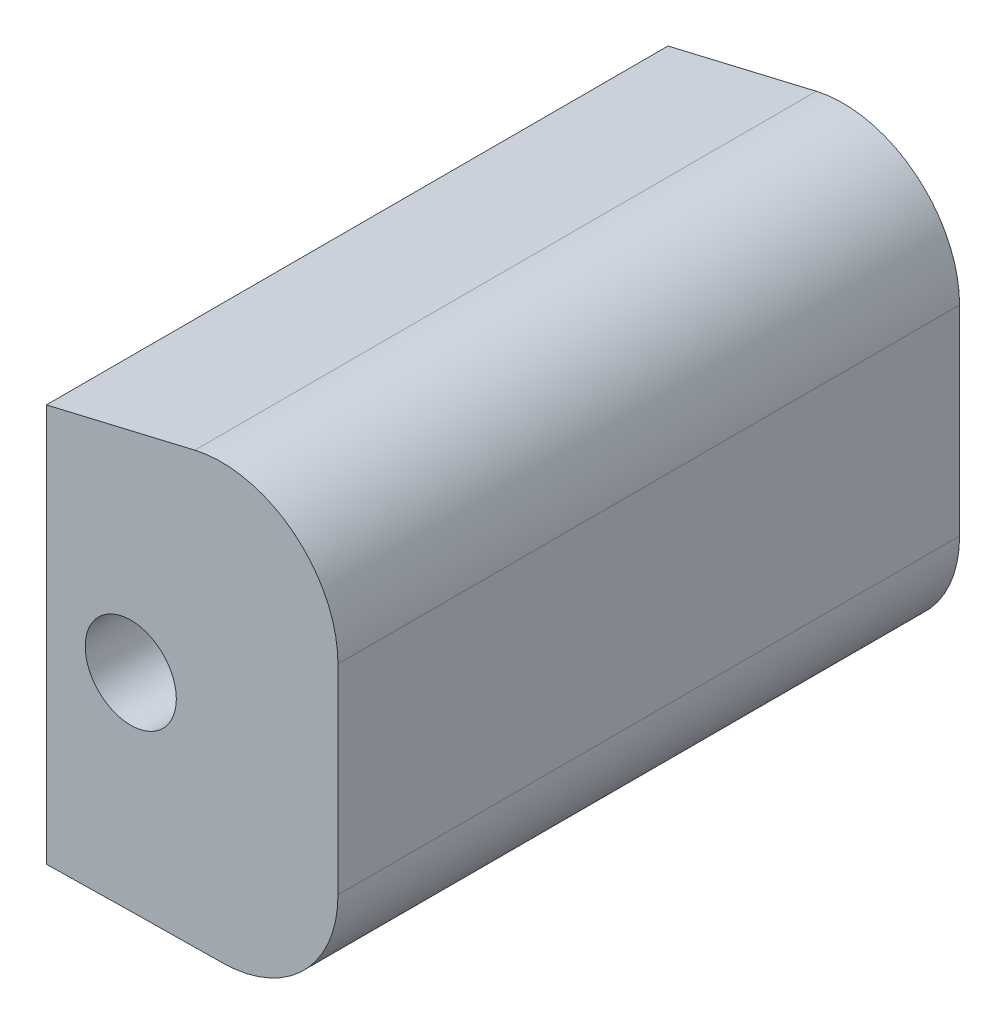
ISO-10303-21;
HEADER;
FILE_DESCRIPTION(('STEP AP214'),'2;1');
FILE_NAME('part.step','',(''),(''),'','','');
FILE_SCHEMA(('AUTOMOTIVE_DESIGN { 1 0 10303 214 1 1 1 1 }'));
ENDSEC;
DATA;
#1=APPLICATION_CONTEXT('core data for automotive mechanical design processes');
#2=APPLICATION_PROTOCOL_DEFINITION('international standard','automotive_design',2000,#1);
#3=PRODUCT_CONTEXT('',#1,'mechanical');
#4=PRODUCT('Part','Part','',(#3));
#5=PRODUCT_RELATED_PRODUCT_CATEGORY('part','',(#4));
#6=PRODUCT_DEFINITION_FORMATION('','',#4);
#7=PRODUCT_DEFINITION_CONTEXT('part definition',#1,'design');
#8=PRODUCT_DEFINITION('design','',#6,#7);
#9=PRODUCT_DEFINITION_SHAPE('','',#8);
#10=(LENGTH_UNIT() NAMED_UNIT(*) SI_UNIT(.MILLI.,.METRE.));
#11=(NAMED_UNIT(*) PLANE_ANGLE_UNIT() SI_UNIT($,.RADIAN.));
#12=(NAMED_UNIT(*) SI_UNIT($,.STERADIAN.) SOLID_ANGLE_UNIT());
#13=UNCERTAINTY_MEASURE_WITH_UNIT(LENGTH_MEASURE(1.E-05),#10,'distance_accuracy_value','');
#14=(GEOMETRIC_REPRESENTATION_CONTEXT(3) GLOBAL_UNCERTAINTY_ASSIGNED_CONTEXT((#13)) GLOBAL_UNIT_ASSIGNED_CONTEXT((#10,
#11,#12)) REPRESENTATION_CONTEXT('',''));
#15=CARTESIAN_POINT('',(0.,0.,0.));
#16=DIRECTION('',(0.,0.,1.));
#17=DIRECTION('',(1.,0.,0.));
#18=AXIS2_PLACEMENT_3D('',#15,#16,#17);
#19=CARTESIAN_POINT('',(-6.3156767121804,2.1580285927083,27.0764));
#20=DIRECTION('',(0.,0.,-1.));
#21=DIRECTION('',(-1.,0.,0.));
#22=AXIS2_PLACEMENT_3D('',#19,#20,#21);
#23=PLANE('',#22);
#24=CARTESIAN_POINT('',(36.6810985985652,13.2095369144677,27.0764));
#25=CARTESIAN_POINT('',(19.8297656446093,9.26724001295322,27.0764));
#26=CARTESIAN_POINT('',(-2.07358994292178,3.84406830419772,27.0764));
#27=CARTESIAN_POINT('',(-31.0964662188296,-5.54591449337639,27.0764));
#28=CARTESIAN_POINT('',(-39.3167651645247,-8.80663166059082,27.0764));
#29=CARTESIAN_POINT('',(-49.5155563234086,-12.4956604853466,27.0764));
#30=CARTESIAN_POINT('',(-45.7724895500792,-12.1068503903365,27.0764));
#31=B_SPLINE_CURVE_WITH_KNOTS('',3,(#24,#25,#26,#27,#28,#29,#30),.UNSPECIFIED.,.F.,.F.,(4,1,1,1,
4),(0.118068853294986,0.630725310694853,0.824213609270468,0.940085476785923,1.),.UNSPECIFIED.);
#32=CARTESIAN_POINT('',(36.6810985985652,13.2095369144677,27.0764));
#33=VERTEX_POINT('',#32);
#34=CARTESIAN_POINT('',(30.218297493358,11.6851028498249,27.0764));
#35=VERTEX_POINT('',#34);
#36=EDGE_CURVE('E107',#33,#35,#31,.T.);
#37=ORIENTED_EDGE('',*,*,#36,.T.);
#38=DIRECTION('',(0.,1.,0.));
#39=VECTOR('',#38,1.);
#40=CARTESIAN_POINT('',(30.218297493358,14.1187599185988,27.0764));
#41=LINE('',#40,#39);
#42=CARTESIAN_POINT('',(30.218297493358,-5.64214160240989,27.0764));
#43=VERTEX_POINT('',#42);
#44=EDGE_CURVE('E101',#43,#35,#41,.T.);
#45=ORIENTED_EDGE('',*,*,#44,.F.);
#46=CARTESIAN_POINT('',(-45.7724895500792,-12.1068503903365,27.0764));
#47=CARTESIAN_POINT('',(-41.3374436992652,-10.9992654887815,27.0764));
#48=CARTESIAN_POINT('',(-33.8316096279073,-10.5300430967119,27.0764));
#49=CARTESIAN_POINT('',(-20.4834982570784,-8.70754719775505,27.0764));
#50=CARTESIAN_POINT('',(-8.87343365419412,-8.01917435004237,27.0764));
#51=CARTESIAN_POINT('',(11.5245885947209,-6.02817132263064,27.0764));
#52=CARTESIAN_POINT('',(26.0673219730606,-5.65978493925108,27.0764));
#53=CARTESIAN_POINT('',(37.8951419594641,-5.52742505549688,27.0764));
#54=B_SPLINE_CURVE_WITH_KNOTS('',3,(#46,#47,#48,#49,#50,#51,#52,#53),.UNSPECIFIED.,.F.,.F.,(4,1,
1,1,1,4),(0.,0.144322392153104,0.23794765175378,0.427122749709389,0.512831912207282,
0.887817721212676),.UNSPECIFIED.);
#55=CARTESIAN_POINT('',(37.8951419594641,-5.52742505549687,27.0764));
#56=VERTEX_POINT('',#55);
#57=EDGE_CURVE('E92',#43,#56,#54,.T.);
#58=ORIENTED_EDGE('',*,*,#57,.T.);
#59=CARTESIAN_POINT('',(37.838297493358,-0.44774310613498,27.0764));
#60=DIRECTION('',(0.,0.,1.));
#61=DIRECTION('',(1.,0.,0.));
#62=AXIS2_PLACEMENT_3D('',#59,#60,#61);
#63=CIRCLE('',#62,5.07999999999999);
#64=CARTESIAN_POINT('',(42.918297493358,-0.44774310613498,27.0764));
#65=VERTEX_POINT('',#64);
#66=EDGE_CURVE('E114',#56,#65,#63,.T.);
#67=ORIENTED_EDGE('',*,*,#66,.T.);
#68=DIRECTION('',(0.,1.,0.));
#69=VECTOR('',#68,1.);
#70=CARTESIAN_POINT('',(42.918297493358,-0.44774310613498,27.0764));
#71=LINE('',#70,#69);
#72=CARTESIAN_POINT('',(42.918297493358,8.26309468616961,27.0764));
#73=VERTEX_POINT('',#72);
#74=EDGE_CURVE('E118',#65,#73,#71,.T.);
#75=ORIENTED_EDGE('',*,*,#74,.T.);
#76=CARTESIAN_POINT('',(37.838297493358,8.26309468616961,27.0764));
#77=DIRECTION('',(0.,0.,1.));
#78=DIRECTION('',(1.,0.,0.));
#79=AXIS2_PLACEMENT_3D('',#76,#77,#78);
#80=CIRCLE('',#79,5.08000000000001);
#81=EDGE_CURVE('E64',#73,#33,#80,.T.);
#82=ORIENTED_EDGE('',*,*,#81,.T.);
#83=EDGE_LOOP('',(#37,#45,#58,#67,#75,#82));
#84=FACE_BOUND('',#83,.T.);
#85=CARTESIAN_POINT('',(33.8934696801539,3.42171785114349,27.0764));
#86=DIRECTION('',(0.,0.,1.));
#87=DIRECTION('',(1.,0.,0.));
#88=AXIS2_PLACEMENT_3D('',#85,#86,#87);
#89=CIRCLE('',#88,1.984375);
#90=CARTESIAN_POINT('',(35.877844680154,3.42171785114349,27.0764));
#91=VERTEX_POINT('',#90);
#92=EDGE_CURVE('E218',#91,#91,#89,.T.);
#93=ORIENTED_EDGE('',*,*,#92,.F.);
#94=EDGE_LOOP('',(#93));
#95=FACE_BOUND('',#94,.T.);
#96=ADVANCED_FACE('F39',(#84,#95),#23,.F.);
#97=CARTESIAN_POINT('',(-6.3156767121804,2.1580285927083,0.));
#98=DIRECTION('',(0.,0.,-1.));
#99=DIRECTION('',(-1.,0.,0.));
#100=AXIS2_PLACEMENT_3D('',#97,#98,#99);
#101=PLANE('',#100);
#102=DIRECTION('',(0.,1.,0.));
#103=VECTOR('',#102,1.);
#104=CARTESIAN_POINT('',(30.218297493358,14.1187599185988,0.));
#105=LINE('',#104,#103);
#106=CARTESIAN_POINT('',(30.2182974931756,-5.64214160240989,0.));
#107=VERTEX_POINT('',#106);
#108=CARTESIAN_POINT('',(30.218297493358,11.6851028498249,0.));
#109=VERTEX_POINT('',#108);
#110=EDGE_CURVE('E56',#107,#109,#105,.T.);
#111=ORIENTED_EDGE('',*,*,#110,.T.);
#112=CARTESIAN_POINT('',(36.6810985985652,13.2095369144677,0.));
#113=CARTESIAN_POINT('',(19.8297656446093,9.26724001295322,0.));
#114=CARTESIAN_POINT('',(-2.07358994292178,3.84406830419772,0.));
#115=CARTESIAN_POINT('',(-31.0964662188296,-5.54591449337639,0.));
#116=CARTESIAN_POINT('',(-39.3167651645247,-8.80663166059082,0.));
#117=CARTESIAN_POINT('',(-49.5155563234086,-12.4956604853466,0.));
#118=CARTESIAN_POINT('',(-45.7724895500792,-12.1068503903365,0.));
#119=B_SPLINE_CURVE_WITH_KNOTS('',3,(#112,#113,#114,#115,#116,#117,#118),.UNSPECIFIED.,.F.,.F.,
(4,1,1,1,4),(0.118068853294986,0.630725310694853,0.824213609270468,0.940085476785923,1.),.UNSPECIFIED.);
#120=CARTESIAN_POINT('',(36.6810985985652,13.2095369144677,0.));
#121=VERTEX_POINT('',#120);
#122=EDGE_CURVE('E213',#121,#109,#119,.T.);
#123=ORIENTED_EDGE('',*,*,#122,.F.);
#124=CARTESIAN_POINT('',(37.838297493358,8.26309468616961,0.));
#125=DIRECTION('',(0.,0.,1.));
#126=DIRECTION('',(1.,0.,0.));
#127=AXIS2_PLACEMENT_3D('',#124,#125,#126);
#128=CIRCLE('',#127,5.08000000000001);
#129=CARTESIAN_POINT('',(42.918297493358,8.26309468616961,0.));
#130=VERTEX_POINT('',#129);
#131=EDGE_CURVE('E85',#130,#121,#128,.T.);
#132=ORIENTED_EDGE('',*,*,#131,.F.);
#133=DIRECTION('',(0.,1.,0.));
#134=VECTOR('',#133,1.);
#135=CARTESIAN_POINT('',(42.918297493358,-0.44774310613498,0.));
#136=LINE('',#135,#134);
#137=CARTESIAN_POINT('',(42.918297493358,-0.44774310613498,0.));
#138=VERTEX_POINT('',#137);
#139=EDGE_CURVE('E241',#138,#130,#136,.T.);
#140=ORIENTED_EDGE('',*,*,#139,.F.);
#141=CARTESIAN_POINT('',(37.838297493358,-0.44774310613498,0.));
#142=DIRECTION('',(0.,0.,1.));
#143=DIRECTION('',(1.,0.,0.));
#144=AXIS2_PLACEMENT_3D('',#141,#142,#143);
#145=CIRCLE('',#144,5.07999999999999);
#146=CARTESIAN_POINT('',(37.8951419594641,-5.52742505549687,0.));
#147=VERTEX_POINT('',#146);
#148=EDGE_CURVE('E222',#147,#138,#145,.T.);
#149=ORIENTED_EDGE('',*,*,#148,.F.);
#150=CARTESIAN_POINT('',(-45.7724895500792,-12.1068503903365,0.));
#151=CARTESIAN_POINT('',(-41.3374436992652,-10.9992654887815,0.));
#152=CARTESIAN_POINT('',(-33.8316096279073,-10.5300430967119,0.));
#153=CARTESIAN_POINT('',(-20.4834982570784,-8.70754719775505,0.));
#154=CARTESIAN_POINT('',(-8.87343365419412,-8.01917435004237,0.));
#155=CARTESIAN_POINT('',(11.5245885947209,-6.02817132263064,0.));
#156=CARTESIAN_POINT('',(26.0673219730606,-5.65978493925108,0.));
#157=CARTESIAN_POINT('',(37.8951419594641,-5.52742505549688,0.));
#158=B_SPLINE_CURVE_WITH_KNOTS('',3,(#150,#151,#152,#153,#154,#155,#156,#157),.UNSPECIFIED.,.F.,
.F.,(4,1,1,1,1,4),(0.,0.144322392153104,0.23794765175378,0.427122749709389,0.512831912207282,
0.887817721212676),.UNSPECIFIED.);
#159=EDGE_CURVE('E217',#107,#147,#158,.T.);
#160=ORIENTED_EDGE('',*,*,#159,.F.);
#161=EDGE_LOOP('',(#111,#123,#132,#140,#149,#160));
#162=FACE_BOUND('',#161,.T.);
#163=CARTESIAN_POINT('',(33.8934696801539,3.42171785114349,0.));
#164=DIRECTION('',(0.,0.,1.));
#165=DIRECTION('',(1.,0.,0.));
#166=AXIS2_PLACEMENT_3D('',#163,#164,#165);
#167=CIRCLE('',#166,1.984375);
#168=CARTESIAN_POINT('',(35.877844680154,3.42171785114349,0.));
#169=VERTEX_POINT('',#168);
#170=EDGE_CURVE('E225',#169,#169,#167,.T.);
#171=ORIENTED_EDGE('',*,*,#170,.T.);
#172=EDGE_LOOP('',(#171));
#173=FACE_BOUND('',#172,.T.);
#174=ADVANCED_FACE('F145',(#162,#173),#101,.T.);
#175=DIRECTION('',(0.,0.,-1.));
#176=VECTOR('',#175,1.);
#177=SURFACE_OF_LINEAR_EXTRUSION('',#31,#176);
#178=ORIENTED_EDGE('',*,*,#122,.T.);
#179=DIRECTION('',(0.,0.,-1.));
#180=VECTOR('',#179,1.);
#181=CARTESIAN_POINT('',(30.218297493358,11.6851028498249,27.0764));
#182=LINE('',#181,#180);
#183=EDGE_CURVE('E214',#109,#35,#182,.F.);
#184=ORIENTED_EDGE('',*,*,#183,.T.);
#185=ORIENTED_EDGE('',*,*,#36,.F.);
#186=DIRECTION('',(0.,0.,-1.));
#187=VECTOR('',#186,1.);
#188=CARTESIAN_POINT('',(36.6810985985652,13.2095369144677,27.0764));
#189=LINE('',#188,#187);
#190=EDGE_CURVE('E215',#33,#121,#189,.T.);
#191=ORIENTED_EDGE('',*,*,#190,.T.);
#192=EDGE_LOOP('',(#178,#184,#185,#191));
#193=FACE_BOUND('',#192,.T.);
#194=ADVANCED_FACE('F41',(#193),#177,.F.);
#195=DIRECTION('',(0.,0.,-1.));
#196=VECTOR('',#195,1.);
#197=SURFACE_OF_LINEAR_EXTRUSION('',#54,#196);
#198=ORIENTED_EDGE('',*,*,#57,.F.);
#199=DIRECTION('',(0.,0.,-1.));
#200=VECTOR('',#199,1.);
#201=CARTESIAN_POINT('',(30.218297493358,-5.64214160240636,27.0764));
#202=LINE('',#201,#200);
#203=EDGE_CURVE('E11',#43,#107,#202,.T.);
#204=ORIENTED_EDGE('',*,*,#203,.T.);
#205=ORIENTED_EDGE('',*,*,#159,.T.);
#206=DIRECTION('',(0.,0.,-1.));
#207=VECTOR('',#206,1.);
#208=CARTESIAN_POINT('',(37.8951419594641,-5.52742505549687,27.0764));
#209=LINE('',#208,#207);
#210=EDGE_CURVE('E49',#56,#147,#209,.T.);
#211=ORIENTED_EDGE('',*,*,#210,.F.);
#212=EDGE_LOOP('',(#198,#204,#205,#211));
#213=FACE_BOUND('',#212,.T.);
#214=ADVANCED_FACE('F110',(#213),#197,.F.);
#215=CARTESIAN_POINT('',(37.838297493358,-0.44774310613498,27.0764));
#216=DIRECTION('',(0.,0.,-1.));
#217=DIRECTION('',(-1.,0.,0.));
#218=AXIS2_PLACEMENT_3D('',#215,#216,#217);
#219=CYLINDRICAL_SURFACE('',#218,5.07999999999999);
#220=ORIENTED_EDGE('',*,*,#148,.T.);
#221=DIRECTION('',(0.,0.,-1.));
#222=VECTOR('',#221,1.);
#223=CARTESIAN_POINT('',(42.918297493358,-0.44774310613498,27.0764));
#224=LINE('',#223,#222);
#225=EDGE_CURVE('E251',#65,#138,#224,.T.);
#226=ORIENTED_EDGE('',*,*,#225,.F.);
#227=ORIENTED_EDGE('',*,*,#66,.F.);
#228=ORIENTED_EDGE('',*,*,#210,.T.);
#229=EDGE_LOOP('',(#220,#226,#227,#228));
#230=FACE_BOUND('',#229,.T.);
#231=ADVANCED_FACE('F133',(#230),#219,.T.);
#232=CARTESIAN_POINT('',(42.918297493358,-0.44774310613498,27.0764));
#233=DIRECTION('',(-1.,0.,0.));
#234=DIRECTION('',(0.,0.,1.));
#235=AXIS2_PLACEMENT_3D('',#232,#233,#234);
#236=PLANE('',#235);
#237=ORIENTED_EDGE('',*,*,#139,.T.);
#238=DIRECTION('',(0.,0.,-1.));
#239=VECTOR('',#238,1.);
#240=CARTESIAN_POINT('',(42.918297493358,8.26309468616961,27.0764));
#241=LINE('',#240,#239);
#242=EDGE_CURVE('E248',#73,#130,#241,.T.);
#243=ORIENTED_EDGE('',*,*,#242,.F.);
#244=ORIENTED_EDGE('',*,*,#74,.F.);
#245=ORIENTED_EDGE('',*,*,#225,.T.);
#246=EDGE_LOOP('',(#237,#243,#244,#245));
#247=FACE_BOUND('',#246,.T.);
#248=ADVANCED_FACE('F136',(#247),#236,.F.);
#249=CARTESIAN_POINT('',(37.838297493358,8.26309468616961,27.0764));
#250=DIRECTION('',(0.,0.,-1.));
#251=DIRECTION('',(-1.,0.,0.));
#252=AXIS2_PLACEMENT_3D('',#249,#250,#251);
#253=CYLINDRICAL_SURFACE('',#252,5.08000000000001);
#254=ORIENTED_EDGE('',*,*,#131,.T.);
#255=ORIENTED_EDGE('',*,*,#190,.F.);
#256=ORIENTED_EDGE('',*,*,#81,.F.);
#257=ORIENTED_EDGE('',*,*,#242,.T.);
#258=EDGE_LOOP('',(#254,#255,#256,#257));
#259=FACE_BOUND('',#258,.T.);
#260=ADVANCED_FACE('F140',(#259),#253,.T.);
#261=CARTESIAN_POINT('',(33.8934696801539,3.42171785114349,27.0764));
#262=DIRECTION('',(0.,0.,-1.));
#263=DIRECTION('',(-1.,0.,0.));
#264=AXIS2_PLACEMENT_3D('',#261,#262,#263);
#265=CYLINDRICAL_SURFACE('',#264,1.984375);
#266=ORIENTED_EDGE('',*,*,#92,.T.);
#267=EDGE_LOOP('',(#266));
#268=FACE_BOUND('',#267,.T.);
#269=ORIENTED_EDGE('',*,*,#170,.F.);
#270=EDGE_LOOP('',(#269));
#271=FACE_BOUND('',#270,.T.);
#272=ADVANCED_FACE('F144',(#268,#271),#265,.F.);
#273=CARTESIAN_POINT('',(30.218297493358,14.1187599185988,0.));
#274=DIRECTION('',(1.,0.,0.));
#275=DIRECTION('',(0.,1.,0.));
#276=AXIS2_PLACEMENT_3D('',#273,#274,#275);
#277=PLANE('',#276);
#278=ORIENTED_EDGE('',*,*,#110,.F.);
#279=ORIENTED_EDGE('',*,*,#203,.F.);
#280=ORIENTED_EDGE('',*,*,#44,.T.);
#281=ORIENTED_EDGE('',*,*,#183,.F.);
#282=EDGE_LOOP('',(#278,#279,#280,#281));
#283=FACE_BOUND('',#282,.T.);
#284=ADVANCED_FACE('F100',(#283),#277,.F.);
#285=CLOSED_SHELL('',(#96,#174,#194,#214,#231,#248,#260,#272,#284));
#286=MANIFOLD_SOLID_BREP('B2',#285);
#287=ADVANCED_BREP_SHAPE_REPRESENTATION('',(#18,#286),#14);
#288=SHAPE_DEFINITION_REPRESENTATION(#9,#287);
ENDSEC;
END-ISO-10303-21;
